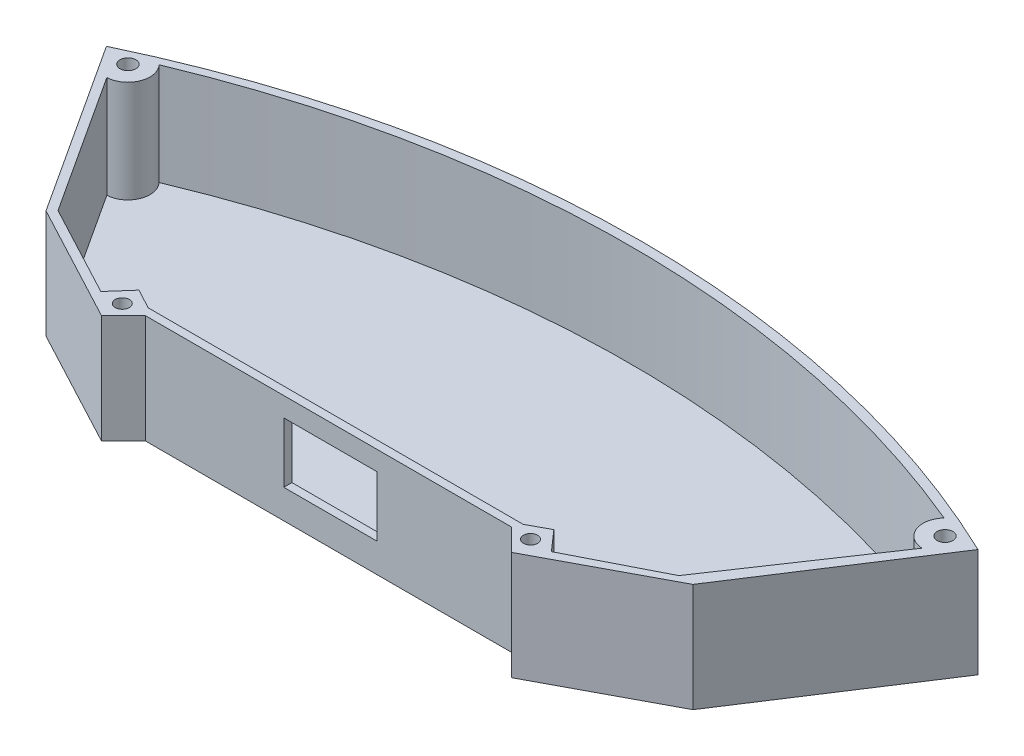
ISO-10303-21;
HEADER;
FILE_DESCRIPTION(('STEP AP214'),'2;1');
FILE_NAME('part.step','',(''),(''),'','','');
FILE_SCHEMA(('AUTOMOTIVE_DESIGN { 1 0 10303 214 1 1 1 1 }'));
ENDSEC;
DATA;
#1=APPLICATION_CONTEXT('core data for automotive mechanical design processes');
#2=APPLICATION_PROTOCOL_DEFINITION('international standard','automotive_design',2000,#1);
#3=PRODUCT_CONTEXT('',#1,'mechanical');
#4=PRODUCT('Part','Part','',(#3));
#5=PRODUCT_RELATED_PRODUCT_CATEGORY('part','',(#4));
#6=PRODUCT_DEFINITION_FORMATION('','',#4);
#7=PRODUCT_DEFINITION_CONTEXT('part definition',#1,'design');
#8=PRODUCT_DEFINITION('design','',#6,#7);
#9=PRODUCT_DEFINITION_SHAPE('','',#8);
#10=(LENGTH_UNIT() NAMED_UNIT(*) SI_UNIT(.MILLI.,.METRE.));
#11=(NAMED_UNIT(*) PLANE_ANGLE_UNIT() SI_UNIT($,.RADIAN.));
#12=(NAMED_UNIT(*) SI_UNIT($,.STERADIAN.) SOLID_ANGLE_UNIT());
#13=UNCERTAINTY_MEASURE_WITH_UNIT(LENGTH_MEASURE(1.E-05),#10,'distance_accuracy_value','');
#14=(GEOMETRIC_REPRESENTATION_CONTEXT(3) GLOBAL_UNCERTAINTY_ASSIGNED_CONTEXT((#13)) GLOBAL_UNIT_ASSIGNED_CONTEXT((#10,
#11,#12)) REPRESENTATION_CONTEXT('',''));
#15=CARTESIAN_POINT('',(0.,0.,0.));
#16=DIRECTION('',(0.,0.,1.));
#17=DIRECTION('',(1.,0.,0.));
#18=AXIS2_PLACEMENT_3D('',#15,#16,#17);
#19=CARTESIAN_POINT('',(-54.022988505747,33.,46.7298850574713));
#20=DIRECTION('',(0.,0.,-1.));
#21=DIRECTION('',(-1.,0.,0.));
#22=AXIS2_PLACEMENT_3D('',#19,#20,#21);
#23=PLANE('',#22);
#24=DIRECTION('',(0.,-1.,0.));
#25=VECTOR('',#24,1.);
#26=CARTESIAN_POINT('',(-54.022988505747,33.,46.7298850574713));
#27=LINE('',#26,#25);
#28=CARTESIAN_POINT('',(-54.022988505747,33.,46.7298850574713));
#29=VERTEX_POINT('',#28);
#30=CARTESIAN_POINT('',(-54.022988505747,0.,46.7298850574713));
#31=VERTEX_POINT('',#30);
#32=EDGE_CURVE('E337',#29,#31,#27,.T.);
#33=ORIENTED_EDGE('',*,*,#32,.T.);
#34=DIRECTION('',(1.,0.,0.));
#35=VECTOR('',#34,1.);
#36=CARTESIAN_POINT('',(-54.022988505747,0.,46.7298850574713));
#37=LINE('',#36,#35);
#38=CARTESIAN_POINT('',(57.277011494253,0.,46.7298850574711));
#39=VERTEX_POINT('',#38);
#40=EDGE_CURVE('E310',#31,#39,#37,.T.);
#41=ORIENTED_EDGE('',*,*,#40,.T.);
#42=DIRECTION('',(0.,-1.,0.));
#43=VECTOR('',#42,1.);
#44=CARTESIAN_POINT('',(57.277011494253,33.,46.7298850574713));
#45=LINE('',#44,#43);
#46=CARTESIAN_POINT('',(57.277011494253,33.,46.7298850574713));
#47=VERTEX_POINT('',#46);
#48=EDGE_CURVE('E335',#47,#39,#45,.T.);
#49=ORIENTED_EDGE('',*,*,#48,.F.);
#50=DIRECTION('',(1.,0.,0.));
#51=VECTOR('',#50,1.);
#52=CARTESIAN_POINT('',(-54.022988505747,33.,46.7298850574713));
#53=LINE('',#52,#51);
#54=EDGE_CURVE('E333',#29,#47,#53,.T.);
#55=ORIENTED_EDGE('',*,*,#54,.F.);
#56=EDGE_LOOP('',(#33,#41,#49,#55));
#57=FACE_BOUND('',#56,.T.);
#58=DIRECTION('',(0.,-1.,0.));
#59=VECTOR('',#58,1.);
#60=CARTESIAN_POINT('',(-11.9525435736632,33.,46.7298850574713));
#61=LINE('',#60,#59);
#62=CARTESIAN_POINT('',(-11.9525435736632,27.1185694186974,46.7298850574713));
#63=VERTEX_POINT('',#62);
#64=CARTESIAN_POINT('',(-11.9525435736632,8.83395002394604,46.7298850574713));
#65=VERTEX_POINT('',#64);
#66=EDGE_CURVE('E209',#63,#65,#61,.T.);
#67=ORIENTED_EDGE('',*,*,#66,.F.);
#68=DIRECTION('',(-1.,0.,0.));
#69=VECTOR('',#68,1.);
#70=CARTESIAN_POINT('',(-54.022988505747,27.1185694186974,46.7298850574713));
#71=LINE('',#70,#69);
#72=CARTESIAN_POINT('',(16.3248329321732,27.1185694186974,46.7298850574713));
#73=VERTEX_POINT('',#72);
#74=EDGE_CURVE('E198',#73,#63,#71,.T.);
#75=ORIENTED_EDGE('',*,*,#74,.F.);
#76=DIRECTION('',(0.,1.,0.));
#77=VECTOR('',#76,1.);
#78=CARTESIAN_POINT('',(16.3248329321732,33.,46.7298850574713));
#79=LINE('',#78,#77);
#80=CARTESIAN_POINT('',(16.3248329321732,8.83395002394604,46.7298850574713));
#81=VERTEX_POINT('',#80);
#82=EDGE_CURVE('E203',#81,#73,#79,.T.);
#83=ORIENTED_EDGE('',*,*,#82,.F.);
#84=DIRECTION('',(1.,0.,0.));
#85=VECTOR('',#84,1.);
#86=CARTESIAN_POINT('',(-54.022988505747,8.83395002394604,46.7298850574713));
#87=LINE('',#86,#85);
#88=EDGE_CURVE('E214',#65,#81,#87,.T.);
#89=ORIENTED_EDGE('',*,*,#88,.F.);
#90=EDGE_LOOP('',(#67,#75,#83,#89));
#91=FACE_BOUND('',#90,.T.);
#92=ADVANCED_FACE('F38',(#57,#91),#23,.F.);
#93=CARTESIAN_POINT('',(58.3673100689032,35.,44.2479466237909));
#94=DIRECTION('',(0.,0.,-1.));
#95=DIRECTION('',(-1.,0.,0.));
#96=AXIS2_PLACEMENT_3D('',#93,#94,#95);
#97=PLANE('',#96);
#98=DIRECTION('',(0.,-1.,0.));
#99=VECTOR('',#98,1.);
#100=CARTESIAN_POINT('',(58.3673100689032,35.,44.2479466237909));
#101=LINE('',#100,#99);
#102=CARTESIAN_POINT('',(58.3673100689032,33.,44.2479466237909));
#103=VERTEX_POINT('',#102);
#104=CARTESIAN_POINT('',(58.3673100689032,2.,44.2479466237909));
#105=VERTEX_POINT('',#104);
#106=EDGE_CURVE('E265',#103,#105,#101,.T.);
#107=ORIENTED_EDGE('',*,*,#106,.T.);
#108=DIRECTION('',(1.,0.,0.));
#109=VECTOR('',#108,1.);
#110=CARTESIAN_POINT('',(58.3673100689032,2.,44.2479466237909));
#111=LINE('',#110,#109);
#112=CARTESIAN_POINT('',(-55.6752411832942,2.,44.2479466237909));
#113=VERTEX_POINT('',#112);
#114=EDGE_CURVE('E237',#113,#105,#111,.T.);
#115=ORIENTED_EDGE('',*,*,#114,.F.);
#116=DIRECTION('',(0.,-1.,0.));
#117=VECTOR('',#116,1.);
#118=CARTESIAN_POINT('',(-55.6752411832942,35.,44.2479466237909));
#119=LINE('',#118,#117);
#120=CARTESIAN_POINT('',(-55.6752411832942,33.,44.2479466237909));
#121=VERTEX_POINT('',#120);
#122=EDGE_CURVE('E267',#121,#113,#119,.T.);
#123=ORIENTED_EDGE('',*,*,#122,.F.);
#124=DIRECTION('',(-1.,0.,0.));
#125=VECTOR('',#124,1.);
#126=CARTESIAN_POINT('',(0.,33.,44.2479466237909));
#127=LINE('',#126,#125);
#128=EDGE_CURVE('E354',#103,#121,#127,.T.);
#129=ORIENTED_EDGE('',*,*,#128,.F.);
#130=EDGE_LOOP('',(#107,#115,#123,#129));
#131=FACE_BOUND('',#130,.T.);
#132=DIRECTION('',(-1.,0.,0.));
#133=VECTOR('',#132,1.);
#134=CARTESIAN_POINT('',(58.3673100689032,27.1185694186974,44.2479466237909));
#135=LINE('',#134,#133);
#136=CARTESIAN_POINT('',(16.3248329321732,27.1185694186974,44.2479466237909));
#137=VERTEX_POINT('',#136);
#138=CARTESIAN_POINT('',(-11.9525435736632,27.1185694186974,44.2479466237909));
#139=VERTEX_POINT('',#138);
#140=EDGE_CURVE('E375',#137,#139,#135,.T.);
#141=ORIENTED_EDGE('',*,*,#140,.T.);
#142=DIRECTION('',(0.,-1.,0.));
#143=VECTOR('',#142,1.);
#144=CARTESIAN_POINT('',(-11.9525435736632,35.,44.2479466237909));
#145=LINE('',#144,#143);
#146=CARTESIAN_POINT('',(-11.9525435736632,8.83395002394604,44.2479466237909));
#147=VERTEX_POINT('',#146);
#148=EDGE_CURVE('E11',#139,#147,#145,.T.);
#149=ORIENTED_EDGE('',*,*,#148,.T.);
#150=DIRECTION('',(1.,0.,0.));
#151=VECTOR('',#150,1.);
#152=CARTESIAN_POINT('',(58.3673100689032,8.83395002394604,44.2479466237909));
#153=LINE('',#152,#151);
#154=CARTESIAN_POINT('',(16.3248329321732,8.83395002394604,44.2479466237909));
#155=VERTEX_POINT('',#154);
#156=EDGE_CURVE('E47',#147,#155,#153,.T.);
#157=ORIENTED_EDGE('',*,*,#156,.T.);
#158=DIRECTION('',(0.,1.,0.));
#159=VECTOR('',#158,1.);
#160=CARTESIAN_POINT('',(16.3248329321732,35.,44.2479466237909));
#161=LINE('',#160,#159);
#162=EDGE_CURVE('E377',#155,#137,#161,.T.);
#163=ORIENTED_EDGE('',*,*,#162,.T.);
#164=EDGE_LOOP('',(#141,#149,#157,#163));
#165=FACE_BOUND('',#164,.T.);
#166=ADVANCED_FACE('F427',(#131,#165),#97,.T.);
#167=CARTESIAN_POINT('',(0.,33.,0.));
#168=DIRECTION('',(0.,1.,0.));
#169=DIRECTION('',(0.,0.,1.));
#170=AXIS2_PLACEMENT_3D('',#167,#168,#169);
#171=PLANE('',#170);
#172=CARTESIAN_POINT('',(-122.881880971691,33.,-16.8045371869603));
#173=DIRECTION('',(0.,1.,0.));
#174=DIRECTION('',(0.,0.,1.));
#175=AXIS2_PLACEMENT_3D('',#172,#173,#174);
#176=CIRCLE('',#175,2.40454982667789);
#177=CARTESIAN_POINT('',(-122.881880971691,33.,-14.3999873602824));
#178=VERTEX_POINT('',#177);
#179=EDGE_CURVE('E42',#178,#178,#176,.F.);
#180=ORIENTED_EDGE('',*,*,#179,.T.);
#181=EDGE_LOOP('',(#180));
#182=FACE_BOUND('',#181,.T.);
#183=CARTESIAN_POINT('',(-60.7281399538195,33.,47.0585659613019));
#184=DIRECTION('',(0.,1.,0.));
#185=DIRECTION('',(0.,0.,1.));
#186=AXIS2_PLACEMENT_3D('',#183,#184,#185);
#187=CIRCLE('',#186,2.15);
#188=CARTESIAN_POINT('',(-60.7281399538195,33.,49.2085659613019));
#189=VERTEX_POINT('',#188);
#190=EDGE_CURVE('E388',#189,#189,#187,.F.);
#191=ORIENTED_EDGE('',*,*,#190,.T.);
#192=EDGE_LOOP('',(#191));
#193=FACE_BOUND('',#192,.T.);
#194=CARTESIAN_POINT('',(63.4202088394284,33.,47.0585659613019));
#195=DIRECTION('',(0.,1.,0.));
#196=DIRECTION('',(0.,0.,1.));
#197=AXIS2_PLACEMENT_3D('',#194,#195,#196);
#198=CIRCLE('',#197,2.15);
#199=CARTESIAN_POINT('',(63.4202088394284,33.,49.2085659613019));
#200=VERTEX_POINT('',#199);
#201=EDGE_CURVE('E385',#200,#200,#198,.F.);
#202=ORIENTED_EDGE('',*,*,#201,.T.);
#203=EDGE_LOOP('',(#202));
#204=FACE_BOUND('',#203,.T.);
#205=CARTESIAN_POINT('',(125.5739498573,33.,-16.8045371869603));
#206=DIRECTION('',(0.,1.,0.));
#207=DIRECTION('',(0.,0.,1.));
#208=AXIS2_PLACEMENT_3D('',#205,#206,#207);
#209=CIRCLE('',#208,2.4045498266779);
#210=CARTESIAN_POINT('',(125.5739498573,33.,-14.3999873602824));
#211=VERTEX_POINT('',#210);
#212=EDGE_CURVE('E382',#211,#211,#209,.F.);
#213=ORIENTED_EDGE('',*,*,#212,.T.);
#214=EDGE_LOOP('',(#213));
#215=FACE_BOUND('',#214,.T.);
#216=ORIENTED_EDGE('',*,*,#54,.T.);
#217=DIRECTION('',(0.707106781186542,0.,0.707106781186553));
#218=VECTOR('',#217,1.);
#219=CARTESIAN_POINT('',(57.277011494253,33.,46.7298850574711));
#220=LINE('',#219,#218);
#221=CARTESIAN_POINT('',(63.9549593167995,33.,53.4078328800177));
#222=VERTEX_POINT('',#221);
#223=EDGE_CURVE('E294',#47,#222,#220,.T.);
#224=ORIENTED_EDGE('',*,*,#223,.T.);
#225=DIRECTION('',(0.8829383241339,0.,-0.469488994307236));
#226=VECTOR('',#225,1.);
#227=CARTESIAN_POINT('',(63.9549593167995,33.,53.4078328800177));
#228=LINE('',#227,#226);
#229=CARTESIAN_POINT('',(99.9780007013989,33.,34.2531297605972));
#230=VERTEX_POINT('',#229);
#231=EDGE_CURVE('E280',#222,#230,#228,.T.);
#232=ORIENTED_EDGE('',*,*,#231,.T.);
#233=DIRECTION('',(0.545088234219341,0.,-0.838378683481182));
#234=VECTOR('',#233,1.);
#235=CARTESIAN_POINT('',(99.9780007013989,33.,34.2531297605972));
#236=LINE('',#235,#234);
#237=CARTESIAN_POINT('',(134.127011494253,33.,-18.2701149425291));
#238=VERTEX_POINT('',#237);
#239=EDGE_CURVE('E283',#230,#238,#236,.T.);
#240=ORIENTED_EDGE('',*,*,#239,.T.);
#241=CARTESIAN_POINT('',(1.62701149425302,33.,259.33405172414));
#242=DIRECTION('',(0.,1.,0.));
#243=DIRECTION('',(0.,0.,-1.));
#244=AXIS2_PLACEMENT_3D('',#241,#242,#243);
#245=CIRCLE('',#244,307.604166666669);
#246=CARTESIAN_POINT('',(-130.872988505747,33.,-18.2701149425287));
#247=VERTEX_POINT('',#246);
#248=EDGE_CURVE('E331',#238,#247,#245,.T.);
#249=ORIENTED_EDGE('',*,*,#248,.T.);
#250=DIRECTION('',(0.545088234219344,0.,0.838378683481181));
#251=VECTOR('',#250,1.);
#252=CARTESIAN_POINT('',(-96.723977712893,33.,34.2531297605975));
#253=LINE('',#252,#251);
#254=CARTESIAN_POINT('',(-96.723977712893,33.,34.2531297605975));
#255=VERTEX_POINT('',#254);
#256=EDGE_CURVE('E287',#247,#255,#253,.T.);
#257=ORIENTED_EDGE('',*,*,#256,.T.);
#258=DIRECTION('',(0.882938324133902,0.,0.469488994307233));
#259=VECTOR('',#258,1.);
#260=CARTESIAN_POINT('',(-60.7009363282935,33.,53.4078328800179));
#261=LINE('',#260,#259);
#262=CARTESIAN_POINT('',(-60.7009363282935,33.,53.4078328800179));
#263=VERTEX_POINT('',#262);
#264=EDGE_CURVE('E289',#255,#263,#261,.T.);
#265=ORIENTED_EDGE('',*,*,#264,.T.);
#266=DIRECTION('',(0.707106781186541,0.,-0.707106781186554));
#267=VECTOR('',#266,1.);
#268=CARTESIAN_POINT('',(-54.022988505747,33.,46.7298850574713));
#269=LINE('',#268,#267);
#270=EDGE_CURVE('E291',#263,#29,#269,.T.);
#271=ORIENTED_EDGE('',*,*,#270,.T.);
#272=EDGE_LOOP('',(#216,#224,#232,#240,#249,#257,#265,#271));
#273=FACE_BOUND('',#272,.T.);
#274=CARTESIAN_POINT('',(-122.881880971691,33.,-16.8045371869603));
#275=DIRECTION('',(0.,1.,0.));
#276=DIRECTION('',(0.,0.,1.));
#277=AXIS2_PLACEMENT_3D('',#274,#275,#276);
#278=CIRCLE('',#277,6.70529743652873);
#279=CARTESIAN_POINT('',(-122.582923997881,33.,-10.1059075927725));
#280=VERTEX_POINT('',#279);
#281=CARTESIAN_POINT('',(-118.009133950936,33.,-21.410766684504));
#282=VERTEX_POINT('',#281);
#283=EDGE_CURVE('E369',#280,#282,#278,.T.);
#284=ORIENTED_EDGE('',*,*,#283,.T.);
#285=CARTESIAN_POINT('',(1.3460344428045,33.,264.183857874996));
#286=DIRECTION('',(0.,1.,0.));
#287=DIRECTION('',(0.,0.,1.));
#288=AXIS2_PLACEMENT_3D('',#285,#286,#287);
#289=CIRCLE('',#288,309.531817103799);
#290=CARTESIAN_POINT('',(120.701202836545,33.,-21.410766684504));
#291=VERTEX_POINT('',#290);
#292=EDGE_CURVE('E372',#282,#291,#289,.F.);
#293=ORIENTED_EDGE('',*,*,#292,.T.);
#294=CARTESIAN_POINT('',(125.5739498573,33.,-16.8045371869603));
#295=DIRECTION('',(0.,1.,0.));
#296=DIRECTION('',(0.,0.,1.));
#297=AXIS2_PLACEMENT_3D('',#294,#295,#296);
#298=CIRCLE('',#297,6.70529743652874);
#299=CARTESIAN_POINT('',(125.27499288349,33.,-10.1059075927725));
#300=VERTEX_POINT('',#299);
#301=EDGE_CURVE('E339',#291,#300,#298,.T.);
#302=ORIENTED_EDGE('',*,*,#301,.T.);
#303=DIRECTION('',(-0.558490655444308,0.,0.829510812335432));
#304=VECTOR('',#303,1.);
#305=CARTESIAN_POINT('',(81.5184382166507,33.,54.8844997719012));
#306=LINE('',#305,#304);
#307=CARTESIAN_POINT('',(95.5186714869773,33.,34.0903382944542));
#308=VERTEX_POINT('',#307);
#309=EDGE_CURVE('E342',#300,#308,#306,.T.);
#310=ORIENTED_EDGE('',*,*,#309,.T.);
#311=DIRECTION('',(-0.891371144833245,0.,0.453274179894101));
#312=VECTOR('',#311,1.);
#313=CARTESIAN_POINT('',(33.3987334613407,33.,65.6791597711809));
#314=LINE('',#313,#312);
#315=CARTESIAN_POINT('',(69.8399892309904,33.,47.1482925571774));
#316=VERTEX_POINT('',#315);
#317=EDGE_CURVE('E345',#308,#316,#314,.T.);
#318=ORIENTED_EDGE('',*,*,#317,.T.);
#319=DIRECTION('',(-0.660842541983658,0.,-0.750524573018484));
#320=VECTOR('',#319,1.);
#321=CARTESIAN_POINT('',(15.9554248589962,33.,-14.0488718175369));
#322=LINE('',#321,#320);
#323=CARTESIAN_POINT('',(64.4097330712587,33.,40.9811038144097));
#324=VERTEX_POINT('',#323);
#325=EDGE_CURVE('E348',#316,#324,#322,.T.);
#326=ORIENTED_EDGE('',*,*,#325,.T.);
#327=DIRECTION('',(-0.879665816790453,0.,0.475592315718394));
#328=VECTOR('',#327,1.);
#329=CARTESIAN_POINT('',(31.7136609398029,33.,58.6582720788654));
#330=LINE('',#329,#328);
#331=EDGE_CURVE('E351',#324,#103,#330,.T.);
#332=ORIENTED_EDGE('',*,*,#331,.T.);
#333=ORIENTED_EDGE('',*,*,#128,.T.);
#334=DIRECTION('',(-0.879665816790452,0.,-0.475592315718396));
#335=VECTOR('',#334,1.);
#336=CARTESIAN_POINT('',(-31.1047471260276,33.,57.532011940409));
#337=LINE('',#336,#335);
#338=CARTESIAN_POINT('',(-61.7176641856497,33.,40.9811038144097));
#339=VERTEX_POINT('',#338);
#340=EDGE_CURVE('E357',#121,#339,#337,.T.);
#341=ORIENTED_EDGE('',*,*,#340,.T.);
#342=DIRECTION('',(-0.660842541983658,0.,0.750524573018484));
#343=VECTOR('',#342,1.);
#344=CARTESIAN_POINT('',(-14.4390170899941,33.,-12.7136633503167));
#345=LINE('',#344,#343);
#346=CARTESIAN_POINT('',(-67.1479203453814,33.,47.1482925571774));
#347=VERTEX_POINT('',#346);
#348=EDGE_CURVE('E360',#339,#347,#345,.T.);
#349=ORIENTED_EDGE('',*,*,#348,.T.);
#350=DIRECTION('',(-0.882938324133902,0.,-0.469488994307233));
#351=VECTOR('',#350,1.);
#352=CARTESIAN_POINT('',(-34.345112449084,33.,64.5906856085752));
#353=LINE('',#352,#351);
#354=CARTESIAN_POINT('',(-94.9800507690141,33.,32.3489814786412));
#355=VERTEX_POINT('',#354);
#356=EDGE_CURVE('E363',#347,#355,#353,.T.);
#357=ORIENTED_EDGE('',*,*,#356,.T.);
#358=DIRECTION('',(-0.545088234219344,0.,-0.83837868348118));
#359=VECTOR('',#358,1.);
#360=CARTESIAN_POINT('',(-81.5426382832869,33.,53.0165348799941));
#361=LINE('',#360,#359);
#362=EDGE_CURVE('E366',#355,#280,#361,.T.);
#363=ORIENTED_EDGE('',*,*,#362,.T.);
#364=EDGE_LOOP('',(#284,#293,#302,#310,#318,#326,#332,#333,#341,#349,#357,#363));
#365=FACE_BOUND('',#364,.T.);
#366=ADVANCED_FACE('F395',(#182,#193,#204,#215,#273,#365),#171,.T.);
#367=CARTESIAN_POINT('',(63.9549593167995,33.,53.4078328800177));
#368=DIRECTION('',(-0.469488994307236,0.,-0.8829383241339));
#369=DIRECTION('',(-0.8829383241339,0.,0.469488994307236));
#370=AXIS2_PLACEMENT_3D('',#367,#368,#369);
#371=PLANE('',#370);
#372=DIRECTION('',(0.8829383241339,0.,-0.469488994307236));
#373=VECTOR('',#372,1.);
#374=CARTESIAN_POINT('',(63.9549593167995,0.,53.4078328800177));
#375=LINE('',#374,#373);
#376=CARTESIAN_POINT('',(63.9549593167995,0.,53.4078328800177));
#377=VERTEX_POINT('',#376);
#378=CARTESIAN_POINT('',(99.9780007013989,0.,34.2531297605972));
#379=VERTEX_POINT('',#378);
#380=EDGE_CURVE('E279',#377,#379,#375,.T.);
#381=ORIENTED_EDGE('',*,*,#380,.T.);
#382=DIRECTION('',(0.,-1.,0.));
#383=VECTOR('',#382,1.);
#384=CARTESIAN_POINT('',(99.9780007013989,33.,34.2531297605972));
#385=LINE('',#384,#383);
#386=EDGE_CURVE('E328',#230,#379,#385,.T.);
#387=ORIENTED_EDGE('',*,*,#386,.F.);
#388=ORIENTED_EDGE('',*,*,#231,.F.);
#389=DIRECTION('',(0.,-1.,0.));
#390=VECTOR('',#389,1.);
#391=CARTESIAN_POINT('',(63.9549593167995,33.,53.4078328800177));
#392=LINE('',#391,#390);
#393=EDGE_CURVE('E296',#222,#377,#392,.T.);
#394=ORIENTED_EDGE('',*,*,#393,.T.);
#395=EDGE_LOOP('',(#381,#387,#388,#394));
#396=FACE_BOUND('',#395,.T.);
#397=ADVANCED_FACE('F435',(#396),#371,.F.);
#398=CARTESIAN_POINT('',(99.9780007013989,33.,34.2531297605972));
#399=DIRECTION('',(-0.838378683481182,0.,-0.545088234219341));
#400=DIRECTION('',(-0.545088234219341,0.,0.838378683481182));
#401=AXIS2_PLACEMENT_3D('',#398,#399,#400);
#402=PLANE('',#401);
#403=DIRECTION('',(0.545088234219341,0.,-0.838378683481182));
#404=VECTOR('',#403,1.);
#405=CARTESIAN_POINT('',(99.9780007013989,0.,34.2531297605972));
#406=LINE('',#405,#404);
#407=CARTESIAN_POINT('',(134.127011494253,0.,-18.2701149425291));
#408=VERTEX_POINT('',#407);
#409=EDGE_CURVE('E299',#379,#408,#406,.T.);
#410=ORIENTED_EDGE('',*,*,#409,.T.);
#411=DIRECTION('',(0.,-1.,0.));
#412=VECTOR('',#411,1.);
#413=CARTESIAN_POINT('',(134.127011494253,33.,-18.2701149425291));
#414=LINE('',#413,#412);
#415=EDGE_CURVE('E325',#238,#408,#414,.T.);
#416=ORIENTED_EDGE('',*,*,#415,.F.);
#417=ORIENTED_EDGE('',*,*,#239,.F.);
#418=ORIENTED_EDGE('',*,*,#386,.T.);
#419=EDGE_LOOP('',(#410,#416,#417,#418));
#420=FACE_BOUND('',#419,.T.);
#421=ADVANCED_FACE('F482',(#420),#402,.F.);
#422=CARTESIAN_POINT('',(-96.723977712893,33.,34.2531297605975));
#423=DIRECTION('',(0.838378683481181,0.,-0.545088234219343));
#424=DIRECTION('',(-0.545088234219343,0.,-0.838378683481181));
#425=AXIS2_PLACEMENT_3D('',#422,#423,#424);
#426=PLANE('',#425);
#427=DIRECTION('',(0.545088234219344,0.,0.838378683481181));
#428=VECTOR('',#427,1.);
#429=CARTESIAN_POINT('',(-96.723977712893,0.,34.2531297605975));
#430=LINE('',#429,#428);
#431=CARTESIAN_POINT('',(-130.872988505747,0.,-18.2701149425287));
#432=VERTEX_POINT('',#431);
#433=CARTESIAN_POINT('',(-96.723977712893,0.,34.2531297605975));
#434=VERTEX_POINT('',#433);
#435=EDGE_CURVE('E303',#432,#434,#430,.T.);
#436=ORIENTED_EDGE('',*,*,#435,.T.);
#437=DIRECTION('',(0.,-1.,0.));
#438=VECTOR('',#437,1.);
#439=CARTESIAN_POINT('',(-96.723977712893,33.,34.2531297605975));
#440=LINE('',#439,#438);
#441=EDGE_CURVE('E319',#255,#434,#440,.T.);
#442=ORIENTED_EDGE('',*,*,#441,.F.);
#443=ORIENTED_EDGE('',*,*,#256,.F.);
#444=DIRECTION('',(0.,-1.,0.));
#445=VECTOR('',#444,1.);
#446=CARTESIAN_POINT('',(-130.872988505747,33.,-18.2701149425287));
#447=LINE('',#446,#445);
#448=EDGE_CURVE('E322',#247,#432,#447,.T.);
#449=ORIENTED_EDGE('',*,*,#448,.T.);
#450=EDGE_LOOP('',(#436,#442,#443,#449));
#451=FACE_BOUND('',#450,.T.);
#452=ADVANCED_FACE('F478',(#451),#426,.F.);
#453=CARTESIAN_POINT('',(-60.7009363282935,33.,53.4078328800179));
#454=DIRECTION('',(0.469488994307233,0.,-0.882938324133902));
#455=DIRECTION('',(-0.882938324133902,0.,-0.469488994307233));
#456=AXIS2_PLACEMENT_3D('',#453,#454,#455);
#457=PLANE('',#456);
#458=DIRECTION('',(0.882938324133902,0.,0.469488994307233));
#459=VECTOR('',#458,1.);
#460=CARTESIAN_POINT('',(-60.7009363282935,0.,53.4078328800179));
#461=LINE('',#460,#459);
#462=CARTESIAN_POINT('',(-60.7009363282935,0.,53.4078328800179));
#463=VERTEX_POINT('',#462);
#464=EDGE_CURVE('E305',#434,#463,#461,.T.);
#465=ORIENTED_EDGE('',*,*,#464,.T.);
#466=DIRECTION('',(0.,-1.,0.));
#467=VECTOR('',#466,1.);
#468=CARTESIAN_POINT('',(-60.7009363282935,33.,53.4078328800179));
#469=LINE('',#468,#467);
#470=EDGE_CURVE('E316',#263,#463,#469,.T.);
#471=ORIENTED_EDGE('',*,*,#470,.F.);
#472=ORIENTED_EDGE('',*,*,#264,.F.);
#473=ORIENTED_EDGE('',*,*,#441,.T.);
#474=EDGE_LOOP('',(#465,#471,#472,#473));
#475=FACE_BOUND('',#474,.T.);
#476=ADVANCED_FACE('F474',(#475),#457,.F.);
#477=CARTESIAN_POINT('',(-54.022988505747,33.,46.7298850574713));
#478=DIRECTION('',(-0.707106781186554,0.,-0.707106781186541));
#479=DIRECTION('',(-0.707106781186541,0.,0.707106781186554));
#480=AXIS2_PLACEMENT_3D('',#477,#478,#479);
#481=PLANE('',#480);
#482=DIRECTION('',(0.707106781186541,0.,-0.707106781186554));
#483=VECTOR('',#482,1.);
#484=CARTESIAN_POINT('',(-54.022988505747,0.,46.7298850574713));
#485=LINE('',#484,#483);
#486=EDGE_CURVE('E307',#463,#31,#485,.T.);
#487=ORIENTED_EDGE('',*,*,#486,.T.);
#488=ORIENTED_EDGE('',*,*,#32,.F.);
#489=ORIENTED_EDGE('',*,*,#270,.F.);
#490=ORIENTED_EDGE('',*,*,#470,.T.);
#491=EDGE_LOOP('',(#487,#488,#489,#490));
#492=FACE_BOUND('',#491,.T.);
#493=ADVANCED_FACE('F470',(#492),#481,.F.);
#494=CARTESIAN_POINT('',(57.277011494253,33.,46.7298850574711));
#495=DIRECTION('',(0.707106781186553,0.,-0.707106781186542));
#496=DIRECTION('',(-0.707106781186542,0.,-0.707106781186553));
#497=AXIS2_PLACEMENT_3D('',#494,#495,#496);
#498=PLANE('',#497);
#499=DIRECTION('',(0.707106781186542,0.,0.707106781186553));
#500=VECTOR('',#499,1.);
#501=CARTESIAN_POINT('',(57.277011494253,0.,46.7298850574711));
#502=LINE('',#501,#500);
#503=EDGE_CURVE('E284',#39,#377,#502,.T.);
#504=ORIENTED_EDGE('',*,*,#503,.T.);
#505=ORIENTED_EDGE('',*,*,#393,.F.);
#506=ORIENTED_EDGE('',*,*,#223,.F.);
#507=ORIENTED_EDGE('',*,*,#48,.T.);
#508=EDGE_LOOP('',(#504,#505,#506,#507));
#509=FACE_BOUND('',#508,.T.);
#510=ADVANCED_FACE('F466',(#509),#498,.F.);
#511=CARTESIAN_POINT('',(1.62701149425302,33.,259.33405172414));
#512=DIRECTION('',(0.,-1.,0.));
#513=DIRECTION('',(0.,0.,-1.));
#514=AXIS2_PLACEMENT_3D('',#511,#512,#513);
#515=CYLINDRICAL_SURFACE('',#514,307.604166666669);
#516=ORIENTED_EDGE('',*,*,#248,.F.);
#517=ORIENTED_EDGE('',*,*,#415,.T.);
#518=CARTESIAN_POINT('',(1.62701149425325,0.,259.334051724141));
#519=DIRECTION('',(0.,1.,0.));
#520=DIRECTION('',(0.,0.,-1.));
#521=AXIS2_PLACEMENT_3D('',#518,#519,#520);
#522=CIRCLE('',#521,307.604166666669);
#523=EDGE_CURVE('E301',#408,#432,#522,.T.);
#524=ORIENTED_EDGE('',*,*,#523,.T.);
#525=ORIENTED_EDGE('',*,*,#448,.F.);
#526=EDGE_LOOP('',(#516,#517,#524,#525));
#527=FACE_BOUND('',#526,.T.);
#528=ADVANCED_FACE('F469',(#527),#515,.T.);
#529=CARTESIAN_POINT('',(0.,0.,0.));
#530=DIRECTION('',(0.,1.,0.));
#531=DIRECTION('',(0.,0.,1.));
#532=AXIS2_PLACEMENT_3D('',#529,#530,#531);
#533=PLANE('',#532);
#534=ORIENTED_EDGE('',*,*,#380,.F.);
#535=ORIENTED_EDGE('',*,*,#503,.F.);
#536=ORIENTED_EDGE('',*,*,#40,.F.);
#537=ORIENTED_EDGE('',*,*,#486,.F.);
#538=ORIENTED_EDGE('',*,*,#464,.F.);
#539=ORIENTED_EDGE('',*,*,#435,.F.);
#540=ORIENTED_EDGE('',*,*,#523,.F.);
#541=ORIENTED_EDGE('',*,*,#409,.F.);
#542=EDGE_LOOP('',(#534,#535,#536,#537,#538,#539,#540,#541));
#543=FACE_BOUND('',#542,.T.);
#544=ADVANCED_FACE('F40',(#543),#533,.F.);
#545=CARTESIAN_POINT('',(1.3460344428045,35.,264.183857874996));
#546=DIRECTION('',(0.,-1.,0.));
#547=DIRECTION('',(0.,0.,-1.));
#548=AXIS2_PLACEMENT_3D('',#545,#546,#547);
#549=CYLINDRICAL_SURFACE('',#548,309.531817103799);
#550=DIRECTION('',(0.,-1.,0.));
#551=VECTOR('',#550,1.);
#552=CARTESIAN_POINT('',(-118.009133950936,35.,-21.410766684504));
#553=LINE('',#552,#551);
#554=CARTESIAN_POINT('',(-118.009133950936,2.,-21.410766684504));
#555=VERTEX_POINT('',#554);
#556=EDGE_CURVE('E277',#282,#555,#553,.T.);
#557=ORIENTED_EDGE('',*,*,#556,.T.);
#558=CARTESIAN_POINT('',(1.3460344428045,2.,264.183857874996));
#559=DIRECTION('',(0.,1.,0.));
#560=DIRECTION('',(0.,0.,-1.));
#561=AXIS2_PLACEMENT_3D('',#558,#559,#560);
#562=CIRCLE('',#561,309.531817103799);
#563=CARTESIAN_POINT('',(120.701202836545,2.,-21.410766684504));
#564=VERTEX_POINT('',#563);
#565=EDGE_CURVE('E215',#564,#555,#562,.T.);
#566=ORIENTED_EDGE('',*,*,#565,.F.);
#567=DIRECTION('',(0.,-1.,0.));
#568=VECTOR('',#567,1.);
#569=CARTESIAN_POINT('',(120.701202836545,35.,-21.410766684504));
#570=LINE('',#569,#568);
#571=EDGE_CURVE('E255',#291,#564,#570,.T.);
#572=ORIENTED_EDGE('',*,*,#571,.F.);
#573=ORIENTED_EDGE('',*,*,#292,.F.);
#574=EDGE_LOOP('',(#557,#566,#572,#573));
#575=FACE_BOUND('',#574,.T.);
#576=ADVANCED_FACE('F461',(#575),#549,.F.);
#577=CARTESIAN_POINT('',(-122.881880971691,35.,-16.8045371869603));
#578=DIRECTION('',(0.,-1.,0.));
#579=DIRECTION('',(0.,0.,-1.));
#580=AXIS2_PLACEMENT_3D('',#577,#578,#579);
#581=CYLINDRICAL_SURFACE('',#580,6.70529743652873);
#582=DIRECTION('',(0.,-1.,0.));
#583=VECTOR('',#582,1.);
#584=CARTESIAN_POINT('',(-122.582923997881,35.,-10.1059075927725));
#585=LINE('',#584,#583);
#586=CARTESIAN_POINT('',(-122.582923997881,2.,-10.1059075927725));
#587=VERTEX_POINT('',#586);
#588=EDGE_CURVE('E275',#280,#587,#585,.T.);
#589=ORIENTED_EDGE('',*,*,#588,.T.);
#590=CARTESIAN_POINT('',(-122.881880971691,2.,-16.8045371869603));
#591=DIRECTION('',(0.,-1.,0.));
#592=DIRECTION('',(0.,0.,-1.));
#593=AXIS2_PLACEMENT_3D('',#590,#591,#592);
#594=CIRCLE('',#593,6.70529743652873);
#595=EDGE_CURVE('E218',#555,#587,#594,.T.);
#596=ORIENTED_EDGE('',*,*,#595,.F.);
#597=ORIENTED_EDGE('',*,*,#556,.F.);
#598=ORIENTED_EDGE('',*,*,#283,.F.);
#599=EDGE_LOOP('',(#589,#596,#597,#598));
#600=FACE_BOUND('',#599,.T.);
#601=ADVANCED_FACE('F457',(#600),#581,.T.);
#602=CARTESIAN_POINT('',(-122.582923997881,35.,-10.1059075927725));
#603=DIRECTION('',(0.83837868348118,0.,-0.545088234219344));
#604=DIRECTION('',(-0.545088234219344,0.,-0.83837868348118));
#605=AXIS2_PLACEMENT_3D('',#602,#603,#604);
#606=PLANE('',#605);
#607=DIRECTION('',(0.,-1.,0.));
#608=VECTOR('',#607,1.);
#609=CARTESIAN_POINT('',(-94.9800507690141,35.,32.3489814786412));
#610=LINE('',#609,#608);
#611=CARTESIAN_POINT('',(-94.9800507690141,2.,32.3489814786412));
#612=VERTEX_POINT('',#611);
#613=EDGE_CURVE('E273',#355,#612,#610,.T.);
#614=ORIENTED_EDGE('',*,*,#613,.T.);
#615=DIRECTION('',(0.545088234219344,0.,0.83837868348118));
#616=VECTOR('',#615,1.);
#617=CARTESIAN_POINT('',(-122.582923997881,2.,-10.1059075927725));
#618=LINE('',#617,#616);
#619=EDGE_CURVE('E225',#587,#612,#618,.T.);
#620=ORIENTED_EDGE('',*,*,#619,.F.);
#621=ORIENTED_EDGE('',*,*,#588,.F.);
#622=ORIENTED_EDGE('',*,*,#362,.F.);
#623=EDGE_LOOP('',(#614,#620,#621,#622));
#624=FACE_BOUND('',#623,.T.);
#625=ADVANCED_FACE('F453',(#624),#606,.T.);
#626=CARTESIAN_POINT('',(-94.9800507690141,35.,32.3489814786412));
#627=DIRECTION('',(0.469488994307233,0.,-0.882938324133902));
#628=DIRECTION('',(-0.882938324133902,0.,-0.469488994307233));
#629=AXIS2_PLACEMENT_3D('',#626,#627,#628);
#630=PLANE('',#629);
#631=DIRECTION('',(0.,-1.,0.));
#632=VECTOR('',#631,1.);
#633=CARTESIAN_POINT('',(-67.1479203453814,35.,47.1482925571774));
#634=LINE('',#633,#632);
#635=CARTESIAN_POINT('',(-67.1479203453814,2.,47.1482925571774));
#636=VERTEX_POINT('',#635);
#637=EDGE_CURVE('E271',#347,#636,#634,.T.);
#638=ORIENTED_EDGE('',*,*,#637,.T.);
#639=DIRECTION('',(0.882938324133902,0.,0.469488994307233));
#640=VECTOR('',#639,1.);
#641=CARTESIAN_POINT('',(-94.9800507690141,2.,32.3489814786412));
#642=LINE('',#641,#640);
#643=EDGE_CURVE('E228',#612,#636,#642,.T.);
#644=ORIENTED_EDGE('',*,*,#643,.F.);
#645=ORIENTED_EDGE('',*,*,#613,.F.);
#646=ORIENTED_EDGE('',*,*,#356,.F.);
#647=EDGE_LOOP('',(#638,#644,#645,#646));
#648=FACE_BOUND('',#647,.T.);
#649=ADVANCED_FACE('F449',(#648),#630,.T.);
#650=CARTESIAN_POINT('',(-61.7176641856497,35.,40.9811038144097));
#651=DIRECTION('',(-0.750524573018484,0.,-0.660842541983658));
#652=DIRECTION('',(-0.660842541983658,0.,0.750524573018484));
#653=AXIS2_PLACEMENT_3D('',#650,#651,#652);
#654=PLANE('',#653);
#655=DIRECTION('',(0.,-1.,0.));
#656=VECTOR('',#655,1.);
#657=CARTESIAN_POINT('',(-61.7176641856497,35.,40.9811038144097));
#658=LINE('',#657,#656);
#659=CARTESIAN_POINT('',(-61.7176641856497,2.,40.9811038144097));
#660=VERTEX_POINT('',#659);
#661=EDGE_CURVE('E269',#339,#660,#658,.T.);
#662=ORIENTED_EDGE('',*,*,#661,.T.);
#663=DIRECTION('',(0.660842541983658,0.,-0.750524573018484));
#664=VECTOR('',#663,1.);
#665=CARTESIAN_POINT('',(-61.7176641856497,2.,40.9811038144097));
#666=LINE('',#665,#664);
#667=EDGE_CURVE('E231',#636,#660,#666,.T.);
#668=ORIENTED_EDGE('',*,*,#667,.F.);
#669=ORIENTED_EDGE('',*,*,#637,.F.);
#670=ORIENTED_EDGE('',*,*,#348,.F.);
#671=EDGE_LOOP('',(#662,#668,#669,#670));
#672=FACE_BOUND('',#671,.T.);
#673=ADVANCED_FACE('F445',(#672),#654,.T.);
#674=CARTESIAN_POINT('',(-55.6752411832942,35.,44.2479466237909));
#675=DIRECTION('',(0.475592315718396,0.,-0.879665816790452));
#676=DIRECTION('',(-0.879665816790452,0.,-0.475592315718396));
#677=AXIS2_PLACEMENT_3D('',#674,#675,#676);
#678=PLANE('',#677);
#679=ORIENTED_EDGE('',*,*,#122,.T.);
#680=DIRECTION('',(0.879665816790453,0.,0.475592315718396));
#681=VECTOR('',#680,1.);
#682=CARTESIAN_POINT('',(-55.6752411832942,2.,44.2479466237909));
#683=LINE('',#682,#681);
#684=EDGE_CURVE('E234',#660,#113,#683,.T.);
#685=ORIENTED_EDGE('',*,*,#684,.F.);
#686=ORIENTED_EDGE('',*,*,#661,.F.);
#687=ORIENTED_EDGE('',*,*,#340,.F.);
#688=EDGE_LOOP('',(#679,#685,#686,#687));
#689=FACE_BOUND('',#688,.T.);
#690=ADVANCED_FACE('F442',(#689),#678,.T.);
#691=CARTESIAN_POINT('',(58.3673100689032,35.,44.2479466237909));
#692=DIRECTION('',(-0.475592315718394,0.,-0.879665816790453));
#693=DIRECTION('',(-0.879665816790453,0.,0.475592315718394));
#694=AXIS2_PLACEMENT_3D('',#691,#692,#693);
#695=PLANE('',#694);
#696=DIRECTION('',(0.,-1.,0.));
#697=VECTOR('',#696,1.);
#698=CARTESIAN_POINT('',(64.4097330712587,35.,40.9811038144097));
#699=LINE('',#698,#697);
#700=CARTESIAN_POINT('',(64.4097330712587,2.,40.9811038144097));
#701=VERTEX_POINT('',#700);
#702=EDGE_CURVE('E263',#324,#701,#699,.T.);
#703=ORIENTED_EDGE('',*,*,#702,.T.);
#704=DIRECTION('',(0.879665816790453,0.,-0.475592315718394));
#705=VECTOR('',#704,1.);
#706=CARTESIAN_POINT('',(58.3673100689032,2.,44.2479466237909));
#707=LINE('',#706,#705);
#708=EDGE_CURVE('E240',#105,#701,#707,.T.);
#709=ORIENTED_EDGE('',*,*,#708,.F.);
#710=ORIENTED_EDGE('',*,*,#106,.F.);
#711=ORIENTED_EDGE('',*,*,#331,.F.);
#712=EDGE_LOOP('',(#703,#709,#710,#711));
#713=FACE_BOUND('',#712,.T.);
#714=ADVANCED_FACE('F440',(#713),#695,.T.);
#715=CARTESIAN_POINT('',(64.4097330712587,35.,40.9811038144097));
#716=DIRECTION('',(0.750524573018484,0.,-0.660842541983658));
#717=DIRECTION('',(-0.660842541983658,0.,-0.750524573018484));
#718=AXIS2_PLACEMENT_3D('',#715,#716,#717);
#719=PLANE('',#718);
#720=DIRECTION('',(0.,-1.,0.));
#721=VECTOR('',#720,1.);
#722=CARTESIAN_POINT('',(69.8399892309904,35.,47.1482925571774));
#723=LINE('',#722,#721);
#724=CARTESIAN_POINT('',(69.8399892309904,2.,47.1482925571774));
#725=VERTEX_POINT('',#724);
#726=EDGE_CURVE('E261',#316,#725,#723,.T.);
#727=ORIENTED_EDGE('',*,*,#726,.T.);
#728=DIRECTION('',(0.660842541983658,0.,0.750524573018484));
#729=VECTOR('',#728,1.);
#730=CARTESIAN_POINT('',(64.4097330712587,2.,40.9811038144097));
#731=LINE('',#730,#729);
#732=EDGE_CURVE('E243',#701,#725,#731,.T.);
#733=ORIENTED_EDGE('',*,*,#732,.F.);
#734=ORIENTED_EDGE('',*,*,#702,.F.);
#735=ORIENTED_EDGE('',*,*,#325,.F.);
#736=EDGE_LOOP('',(#727,#733,#734,#735));
#737=FACE_BOUND('',#736,.T.);
#738=ADVANCED_FACE('F538',(#737),#719,.T.);
#739=CARTESIAN_POINT('',(69.8399892309904,35.,47.1482925571774));
#740=DIRECTION('',(-0.453274179894101,0.,-0.891371144833245));
#741=DIRECTION('',(-0.891371144833245,0.,0.453274179894101));
#742=AXIS2_PLACEMENT_3D('',#739,#740,#741);
#743=PLANE('',#742);
#744=DIRECTION('',(0.,-1.,0.));
#745=VECTOR('',#744,1.);
#746=CARTESIAN_POINT('',(95.5186714869773,35.,34.0903382944542));
#747=LINE('',#746,#745);
#748=CARTESIAN_POINT('',(95.5186714869773,2.,34.0903382944542));
#749=VERTEX_POINT('',#748);
#750=EDGE_CURVE('E259',#308,#749,#747,.T.);
#751=ORIENTED_EDGE('',*,*,#750,.T.);
#752=DIRECTION('',(0.891371144833245,0.,-0.453274179894101));
#753=VECTOR('',#752,1.);
#754=CARTESIAN_POINT('',(69.8399892309904,2.,47.1482925571774));
#755=LINE('',#754,#753);
#756=EDGE_CURVE('E246',#725,#749,#755,.T.);
#757=ORIENTED_EDGE('',*,*,#756,.F.);
#758=ORIENTED_EDGE('',*,*,#726,.F.);
#759=ORIENTED_EDGE('',*,*,#317,.F.);
#760=EDGE_LOOP('',(#751,#757,#758,#759));
#761=FACE_BOUND('',#760,.T.);
#762=ADVANCED_FACE('F543',(#761),#743,.T.);
#763=CARTESIAN_POINT('',(95.5186714869773,35.,34.0903382944542));
#764=DIRECTION('',(-0.829510812335432,0.,-0.558490655444308));
#765=DIRECTION('',(-0.558490655444308,0.,0.829510812335432));
#766=AXIS2_PLACEMENT_3D('',#763,#764,#765);
#767=PLANE('',#766);
#768=DIRECTION('',(0.,-1.,0.));
#769=VECTOR('',#768,1.);
#770=CARTESIAN_POINT('',(125.27499288349,35.,-10.1059075927725));
#771=LINE('',#770,#769);
#772=CARTESIAN_POINT('',(125.27499288349,2.,-10.1059075927725));
#773=VERTEX_POINT('',#772);
#774=EDGE_CURVE('E257',#300,#773,#771,.T.);
#775=ORIENTED_EDGE('',*,*,#774,.T.);
#776=DIRECTION('',(0.558490655444308,0.,-0.829510812335432));
#777=VECTOR('',#776,1.);
#778=CARTESIAN_POINT('',(95.5186714869773,2.,34.0903382944542));
#779=LINE('',#778,#777);
#780=EDGE_CURVE('E249',#749,#773,#779,.T.);
#781=ORIENTED_EDGE('',*,*,#780,.F.);
#782=ORIENTED_EDGE('',*,*,#750,.F.);
#783=ORIENTED_EDGE('',*,*,#309,.F.);
#784=EDGE_LOOP('',(#775,#781,#782,#783));
#785=FACE_BOUND('',#784,.T.);
#786=ADVANCED_FACE('F547',(#785),#767,.T.);
#787=CARTESIAN_POINT('',(125.5739498573,35.,-16.8045371869603));
#788=DIRECTION('',(0.,-1.,0.));
#789=DIRECTION('',(0.,0.,-1.));
#790=AXIS2_PLACEMENT_3D('',#787,#788,#789);
#791=CYLINDRICAL_SURFACE('',#790,6.70529743652874);
#792=ORIENTED_EDGE('',*,*,#571,.T.);
#793=CARTESIAN_POINT('',(125.5739498573,2.,-16.8045371869603));
#794=DIRECTION('',(0.,-1.,0.));
#795=DIRECTION('',(0.,0.,1.));
#796=AXIS2_PLACEMENT_3D('',#793,#794,#795);
#797=CIRCLE('',#796,6.70529743652874);
#798=EDGE_CURVE('E252',#773,#564,#797,.T.);
#799=ORIENTED_EDGE('',*,*,#798,.F.);
#800=ORIENTED_EDGE('',*,*,#774,.F.);
#801=ORIENTED_EDGE('',*,*,#301,.F.);
#802=EDGE_LOOP('',(#792,#799,#800,#801));
#803=FACE_BOUND('',#802,.T.);
#804=ADVANCED_FACE('F551',(#803),#791,.T.);
#805=CARTESIAN_POINT('',(1.3460344428045,2.,264.183857874996));
#806=DIRECTION('',(0.,-1.,0.));
#807=DIRECTION('',(0.,0.,-1.));
#808=AXIS2_PLACEMENT_3D('',#805,#806,#807);
#809=PLANE('',#808);
#810=ORIENTED_EDGE('',*,*,#565,.T.);
#811=ORIENTED_EDGE('',*,*,#595,.T.);
#812=ORIENTED_EDGE('',*,*,#619,.T.);
#813=ORIENTED_EDGE('',*,*,#643,.T.);
#814=ORIENTED_EDGE('',*,*,#667,.T.);
#815=ORIENTED_EDGE('',*,*,#684,.T.);
#816=ORIENTED_EDGE('',*,*,#114,.T.);
#817=ORIENTED_EDGE('',*,*,#708,.T.);
#818=ORIENTED_EDGE('',*,*,#732,.T.);
#819=ORIENTED_EDGE('',*,*,#756,.T.);
#820=ORIENTED_EDGE('',*,*,#780,.T.);
#821=ORIENTED_EDGE('',*,*,#798,.T.);
#822=EDGE_LOOP('',(#810,#811,#812,#813,#814,#815,#816,#817,#818,#819,#820,#821));
#823=FACE_BOUND('',#822,.T.);
#824=ADVANCED_FACE('F525',(#823),#809,.F.);
#825=CARTESIAN_POINT('',(-11.9525435736632,27.1185694186974,63.));
#826=DIRECTION('',(1.,0.,0.));
#827=DIRECTION('',(0.,0.,-1.));
#828=AXIS2_PLACEMENT_3D('',#825,#826,#827);
#829=PLANE('',#828);
#830=ORIENTED_EDGE('',*,*,#66,.T.);
#831=DIRECTION('',(0.,0.,-1.));
#832=VECTOR('',#831,1.);
#833=CARTESIAN_POINT('',(-11.9525435736632,8.83395002394604,63.));
#834=LINE('',#833,#832);
#835=EDGE_CURVE('E204',#65,#147,#834,.T.);
#836=ORIENTED_EDGE('',*,*,#835,.T.);
#837=ORIENTED_EDGE('',*,*,#148,.F.);
#838=DIRECTION('',(0.,0.,-1.));
#839=VECTOR('',#838,1.);
#840=CARTESIAN_POINT('',(-11.9525435736632,27.1185694186974,63.));
#841=LINE('',#840,#839);
#842=EDGE_CURVE('E60',#63,#139,#841,.T.);
#843=ORIENTED_EDGE('',*,*,#842,.F.);
#844=EDGE_LOOP('',(#830,#836,#837,#843));
#845=FACE_BOUND('',#844,.T.);
#846=ADVANCED_FACE('F207',(#845),#829,.T.);
#847=CARTESIAN_POINT('',(-11.9525435736632,8.83395002394604,63.));
#848=DIRECTION('',(0.,1.,0.));
#849=DIRECTION('',(0.,0.,1.));
#850=AXIS2_PLACEMENT_3D('',#847,#848,#849);
#851=PLANE('',#850);
#852=ORIENTED_EDGE('',*,*,#88,.T.);
#853=DIRECTION('',(0.,0.,-1.));
#854=VECTOR('',#853,1.);
#855=CARTESIAN_POINT('',(16.3248329321732,8.83395002394604,63.));
#856=LINE('',#855,#854);
#857=EDGE_CURVE('E418',#81,#155,#856,.T.);
#858=ORIENTED_EDGE('',*,*,#857,.T.);
#859=ORIENTED_EDGE('',*,*,#156,.F.);
#860=ORIENTED_EDGE('',*,*,#835,.F.);
#861=EDGE_LOOP('',(#852,#858,#859,#860));
#862=FACE_BOUND('',#861,.T.);
#863=ADVANCED_FACE('F425',(#862),#851,.T.);
#864=CARTESIAN_POINT('',(16.3248329321732,27.1185694186974,63.));
#865=DIRECTION('',(-1.,0.,0.));
#866=DIRECTION('',(0.,0.,1.));
#867=AXIS2_PLACEMENT_3D('',#864,#865,#866);
#868=PLANE('',#867);
#869=ORIENTED_EDGE('',*,*,#82,.T.);
#870=DIRECTION('',(0.,0.,-1.));
#871=VECTOR('',#870,1.);
#872=CARTESIAN_POINT('',(16.3248329321732,27.1185694186974,63.));
#873=LINE('',#872,#871);
#874=EDGE_CURVE('E55',#73,#137,#873,.T.);
#875=ORIENTED_EDGE('',*,*,#874,.T.);
#876=ORIENTED_EDGE('',*,*,#162,.F.);
#877=ORIENTED_EDGE('',*,*,#857,.F.);
#878=EDGE_LOOP('',(#869,#875,#876,#877));
#879=FACE_BOUND('',#878,.T.);
#880=ADVANCED_FACE('F423',(#879),#868,.T.);
#881=CARTESIAN_POINT('',(-11.9525435736632,27.1185694186974,63.));
#882=DIRECTION('',(0.,-1.,0.));
#883=DIRECTION('',(0.,0.,-1.));
#884=AXIS2_PLACEMENT_3D('',#881,#882,#883);
#885=PLANE('',#884);
#886=ORIENTED_EDGE('',*,*,#74,.T.);
#887=ORIENTED_EDGE('',*,*,#842,.T.);
#888=ORIENTED_EDGE('',*,*,#140,.F.);
#889=ORIENTED_EDGE('',*,*,#874,.F.);
#890=EDGE_LOOP('',(#886,#887,#888,#889));
#891=FACE_BOUND('',#890,.T.);
#892=ADVANCED_FACE('F199',(#891),#885,.T.);
#893=CARTESIAN_POINT('',(125.5739498573,78.,-16.8045371869603));
#894=DIRECTION('',(0.,-1.,0.));
#895=DIRECTION('',(0.,0.,-1.));
#896=AXIS2_PLACEMENT_3D('',#893,#894,#895);
#897=CYLINDRICAL_SURFACE('',#896,2.4045498266779);
#898=ORIENTED_EDGE('',*,*,#212,.F.);
#899=EDGE_LOOP('',(#898));
#900=FACE_BOUND('',#899,.T.);
#901=CARTESIAN_POINT('',(125.5739498573,15.,-16.8045371869603));
#902=DIRECTION('',(0.,1.,0.));
#903=DIRECTION('',(0.,0.,-1.));
#904=AXIS2_PLACEMENT_3D('',#901,#902,#903);
#905=CIRCLE('',#904,2.4045498266779);
#906=CARTESIAN_POINT('',(125.5739498573,15.,-19.2090870136382));
#907=VERTEX_POINT('',#906);
#908=EDGE_CURVE('E414',#907,#907,#905,.T.);
#909=ORIENTED_EDGE('',*,*,#908,.F.);
#910=EDGE_LOOP('',(#909));
#911=FACE_BOUND('',#910,.T.);
#912=ADVANCED_FACE('F664',(#900,#911),#897,.F.);
#913=CARTESIAN_POINT('',(125.5739498573,15.,-16.8045371869603));
#914=DIRECTION('',(0.,-1.,0.));
#915=DIRECTION('',(0.,0.,-1.));
#916=AXIS2_PLACEMENT_3D('',#913,#914,#915);
#917=PLANE('',#916);
#918=ORIENTED_EDGE('',*,*,#908,.T.);
#919=EDGE_LOOP('',(#918));
#920=FACE_BOUND('',#919,.T.);
#921=ADVANCED_FACE('F669',(#920),#917,.F.);
#922=CARTESIAN_POINT('',(63.4202088394284,78.,47.0585659613019));
#923=DIRECTION('',(0.,-1.,0.));
#924=DIRECTION('',(0.,0.,-1.));
#925=AXIS2_PLACEMENT_3D('',#922,#923,#924);
#926=CYLINDRICAL_SURFACE('',#925,2.15);
#927=ORIENTED_EDGE('',*,*,#201,.F.);
#928=EDGE_LOOP('',(#927));
#929=FACE_BOUND('',#928,.T.);
#930=CARTESIAN_POINT('',(63.4202088394284,15.,47.0585659613019));
#931=DIRECTION('',(0.,1.,0.));
#932=DIRECTION('',(0.,0.,-1.));
#933=AXIS2_PLACEMENT_3D('',#930,#931,#932);
#934=CIRCLE('',#933,2.15);
#935=CARTESIAN_POINT('',(63.4202088394284,15.,44.9085659613019));
#936=VERTEX_POINT('',#935);
#937=EDGE_CURVE('E409',#936,#936,#934,.T.);
#938=ORIENTED_EDGE('',*,*,#937,.F.);
#939=EDGE_LOOP('',(#938));
#940=FACE_BOUND('',#939,.T.);
#941=ADVANCED_FACE('F680',(#929,#940),#926,.F.);
#942=CARTESIAN_POINT('',(63.4202088394284,15.,47.0585659613019));
#943=DIRECTION('',(0.,-1.,0.));
#944=DIRECTION('',(0.,0.,-1.));
#945=AXIS2_PLACEMENT_3D('',#942,#943,#944);
#946=PLANE('',#945);
#947=ORIENTED_EDGE('',*,*,#937,.T.);
#948=EDGE_LOOP('',(#947));
#949=FACE_BOUND('',#948,.T.);
#950=ADVANCED_FACE('F691',(#949),#946,.F.);
#951=CARTESIAN_POINT('',(-60.7281399538195,78.,47.0585659613019));
#952=DIRECTION('',(0.,-1.,0.));
#953=DIRECTION('',(0.,0.,-1.));
#954=AXIS2_PLACEMENT_3D('',#951,#952,#953);
#955=CYLINDRICAL_SURFACE('',#954,2.15);
#956=ORIENTED_EDGE('',*,*,#190,.F.);
#957=EDGE_LOOP('',(#956));
#958=FACE_BOUND('',#957,.T.);
#959=CARTESIAN_POINT('',(-60.7281399538195,15.,47.0585659613019));
#960=DIRECTION('',(0.,1.,0.));
#961=DIRECTION('',(0.,0.,1.));
#962=AXIS2_PLACEMENT_3D('',#959,#960,#961);
#963=CIRCLE('',#962,2.15);
#964=CARTESIAN_POINT('',(-60.7281399538195,15.,49.2085659613019));
#965=VERTEX_POINT('',#964);
#966=EDGE_CURVE('E406',#965,#965,#963,.T.);
#967=ORIENTED_EDGE('',*,*,#966,.F.);
#968=EDGE_LOOP('',(#967));
#969=FACE_BOUND('',#968,.T.);
#970=ADVANCED_FACE('F702',(#958,#969),#955,.F.);
#971=CARTESIAN_POINT('',(-60.7281399538195,15.,47.0585659613019));
#972=DIRECTION('',(0.,1.,0.));
#973=DIRECTION('',(0.,0.,1.));
#974=AXIS2_PLACEMENT_3D('',#971,#972,#973);
#975=PLANE('',#974);
#976=ORIENTED_EDGE('',*,*,#966,.T.);
#977=EDGE_LOOP('',(#976));
#978=FACE_BOUND('',#977,.T.);
#979=ADVANCED_FACE('F401',(#978),#975,.T.);
#980=CARTESIAN_POINT('',(-122.881880971691,78.,-16.8045371869603));
#981=DIRECTION('',(0.,-1.,0.));
#982=DIRECTION('',(0.,0.,-1.));
#983=AXIS2_PLACEMENT_3D('',#980,#981,#982);
#984=CYLINDRICAL_SURFACE('',#983,2.40454982667789);
#985=ORIENTED_EDGE('',*,*,#179,.F.);
#986=EDGE_LOOP('',(#985));
#987=FACE_BOUND('',#986,.T.);
#988=CARTESIAN_POINT('',(-122.881880971691,15.,-16.8045371869603));
#989=DIRECTION('',(0.,1.,0.));
#990=DIRECTION('',(0.,0.,1.));
#991=AXIS2_PLACEMENT_3D('',#988,#989,#990);
#992=CIRCLE('',#991,2.40454982667789);
#993=CARTESIAN_POINT('',(-122.881880971691,15.,-14.3999873602824));
#994=VERTEX_POINT('',#993);
#995=EDGE_CURVE('E386',#994,#994,#992,.T.);
#996=ORIENTED_EDGE('',*,*,#995,.F.);
#997=EDGE_LOOP('',(#996));
#998=FACE_BOUND('',#997,.T.);
#999=ADVANCED_FACE('F397',(#987,#998),#984,.F.);
#1000=CARTESIAN_POINT('',(-122.881880971691,15.,-16.8045371869603));
#1001=DIRECTION('',(0.,1.,0.));
#1002=DIRECTION('',(0.,0.,1.));
#1003=AXIS2_PLACEMENT_3D('',#1000,#1001,#1002);
#1004=PLANE('',#1003);
#1005=ORIENTED_EDGE('',*,*,#995,.T.);
#1006=EDGE_LOOP('',(#1005));
#1007=FACE_BOUND('',#1006,.T.);
#1008=ADVANCED_FACE('F400',(#1007),#1004,.T.);
#1009=CLOSED_SHELL('',(#92,#166,#366,#397,#421,#452,#476,#493,#510,#528,#544,#576,#601,#625,
#649,#673,#690,#714,#738,#762,#786,#804,#824,#846,#863,#880,#892,#912,#921,#941,#950,#970,#979,
#999,#1008));
#1010=MANIFOLD_SOLID_BREP('B2',#1009);
#1011=ADVANCED_BREP_SHAPE_REPRESENTATION('',(#18,#1010),#14);
#1012=SHAPE_DEFINITION_REPRESENTATION(#9,#1011);
ENDSEC;
END-ISO-10303-21;
